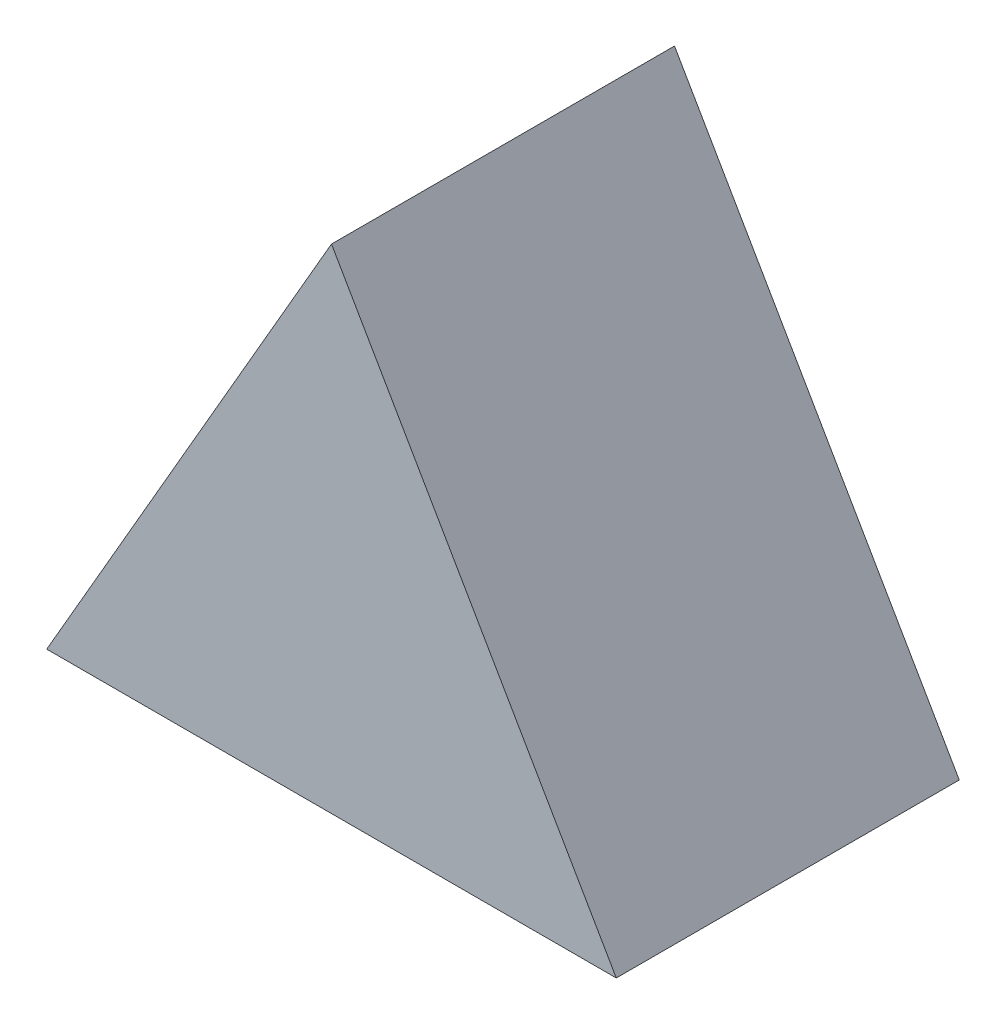
ISO-10303-21;
HEADER;
FILE_DESCRIPTION(('STEP AP214'),'2;1');
FILE_NAME('part.step','',(''),(''),'','','');
FILE_SCHEMA(('AUTOMOTIVE_DESIGN { 1 0 10303 214 1 1 1 1 }'));
ENDSEC;
DATA;
#1=APPLICATION_CONTEXT('core data for automotive mechanical design processes');
#2=APPLICATION_PROTOCOL_DEFINITION('international standard','automotive_design',2000,#1);
#3=PRODUCT_CONTEXT('',#1,'mechanical');
#4=PRODUCT('Part','Part','',(#3));
#5=PRODUCT_RELATED_PRODUCT_CATEGORY('part','',(#4));
#6=PRODUCT_DEFINITION_FORMATION('','',#4);
#7=PRODUCT_DEFINITION_CONTEXT('part definition',#1,'design');
#8=PRODUCT_DEFINITION('design','',#6,#7);
#9=PRODUCT_DEFINITION_SHAPE('','',#8);
#10=(LENGTH_UNIT() NAMED_UNIT(*) SI_UNIT(.MILLI.,.METRE.));
#11=(NAMED_UNIT(*) PLANE_ANGLE_UNIT() SI_UNIT($,.RADIAN.));
#12=(NAMED_UNIT(*) SI_UNIT($,.STERADIAN.) SOLID_ANGLE_UNIT());
#13=UNCERTAINTY_MEASURE_WITH_UNIT(LENGTH_MEASURE(1.E-05),#10,'distance_accuracy_value','');
#14=(GEOMETRIC_REPRESENTATION_CONTEXT(3) GLOBAL_UNCERTAINTY_ASSIGNED_CONTEXT((#13)) GLOBAL_UNIT_ASSIGNED_CONTEXT((#10,
#11,#12)) REPRESENTATION_CONTEXT('',''));
#15=CARTESIAN_POINT('',(0.,0.,0.));
#16=DIRECTION('',(0.,0.,1.));
#17=DIRECTION('',(1.,0.,0.));
#18=AXIS2_PLACEMENT_3D('',#15,#16,#17);
#19=CARTESIAN_POINT('',(2.84589838486225,-2.,3.8));
#20=DIRECTION('',(-0.866025403784439,-0.5,0.));
#21=DIRECTION('',(0.5,-0.866025403784439,0.));
#22=AXIS2_PLACEMENT_3D('',#19,#20,#21);
#23=PLANE('',#22);
#24=DIRECTION('',(-0.5,0.866025403784439,0.));
#25=VECTOR('',#24,1.);
#26=CARTESIAN_POINT('',(2.84589838486225,-2.,0.));
#27=LINE('',#26,#25);
#28=CARTESIAN_POINT('',(2.84589838486225,-2.,0.));
#29=VERTEX_POINT('',#28);
#30=CARTESIAN_POINT('',(-0.309101615137755,3.46462029787981,0.));
#31=VERTEX_POINT('',#30);
#32=EDGE_CURVE('E93',#29,#31,#27,.T.);
#33=ORIENTED_EDGE('',*,*,#32,.T.);
#34=DIRECTION('',(0.,0.,-1.));
#35=VECTOR('',#34,1.);
#36=CARTESIAN_POINT('',(-0.309101615137755,3.46462029787981,3.8));
#37=LINE('',#36,#35);
#38=CARTESIAN_POINT('',(-0.309101615137755,3.46462029787981,3.8));
#39=VERTEX_POINT('',#38);
#40=EDGE_CURVE('E11',#39,#31,#37,.T.);
#41=ORIENTED_EDGE('',*,*,#40,.F.);
#42=DIRECTION('',(-0.5,0.866025403784439,0.));
#43=VECTOR('',#42,1.);
#44=CARTESIAN_POINT('',(2.84589838486225,-2.,3.8));
#45=LINE('',#44,#43);
#46=CARTESIAN_POINT('',(2.84589838486225,-2.,3.8));
#47=VERTEX_POINT('',#46);
#48=EDGE_CURVE('E85',#47,#39,#45,.T.);
#49=ORIENTED_EDGE('',*,*,#48,.F.);
#50=DIRECTION('',(0.,0.,-1.));
#51=VECTOR('',#50,1.);
#52=CARTESIAN_POINT('',(2.84589838486225,-2.,3.8));
#53=LINE('',#52,#51);
#54=EDGE_CURVE('E94',#47,#29,#53,.T.);
#55=ORIENTED_EDGE('',*,*,#54,.T.);
#56=EDGE_LOOP('',(#33,#41,#49,#55));
#57=FACE_BOUND('',#56,.T.);
#58=ADVANCED_FACE('F43',(#57),#23,.F.);
#59=CARTESIAN_POINT('',(-0.309101615137755,3.46462029787981,3.8));
#60=DIRECTION('',(0.866025403784439,-0.5,0.));
#61=DIRECTION('',(0.5,0.866025403784439,0.));
#62=AXIS2_PLACEMENT_3D('',#59,#60,#61);
#63=PLANE('',#62);
#64=DIRECTION('',(-0.5,-0.866025403784439,0.));
#65=VECTOR('',#64,1.);
#66=CARTESIAN_POINT('',(-0.309101615137755,3.46462029787981,0.));
#67=LINE('',#66,#65);
#68=CARTESIAN_POINT('',(-3.46410161513775,-2.,0.));
#69=VERTEX_POINT('',#68);
#70=EDGE_CURVE('E72',#31,#69,#67,.T.);
#71=ORIENTED_EDGE('',*,*,#70,.T.);
#72=DIRECTION('',(0.,0.,-1.));
#73=VECTOR('',#72,1.);
#74=CARTESIAN_POINT('',(-3.46410161513775,-2.,3.8));
#75=LINE('',#74,#73);
#76=CARTESIAN_POINT('',(-3.46410161513775,-2.,3.8));
#77=VERTEX_POINT('',#76);
#78=EDGE_CURVE('E52',#77,#69,#75,.T.);
#79=ORIENTED_EDGE('',*,*,#78,.F.);
#80=DIRECTION('',(-0.5,-0.866025403784439,0.));
#81=VECTOR('',#80,1.);
#82=CARTESIAN_POINT('',(-0.309101615137755,3.46462029787981,3.8));
#83=LINE('',#82,#81);
#84=EDGE_CURVE('E80',#39,#77,#83,.T.);
#85=ORIENTED_EDGE('',*,*,#84,.F.);
#86=ORIENTED_EDGE('',*,*,#40,.T.);
#87=EDGE_LOOP('',(#71,#79,#85,#86));
#88=FACE_BOUND('',#87,.T.);
#89=ADVANCED_FACE('F81',(#88),#63,.F.);
#90=CARTESIAN_POINT('',(-3.46410161513775,-2.,3.8));
#91=DIRECTION('',(0.,1.,0.));
#92=DIRECTION('',(0.,0.,1.));
#93=AXIS2_PLACEMENT_3D('',#90,#91,#92);
#94=PLANE('',#93);
#95=DIRECTION('',(1.,0.,0.));
#96=VECTOR('',#95,1.);
#97=CARTESIAN_POINT('',(-3.46410161513775,-2.,0.));
#98=LINE('',#97,#96);
#99=EDGE_CURVE('E77',#69,#29,#98,.T.);
#100=ORIENTED_EDGE('',*,*,#99,.T.);
#101=ORIENTED_EDGE('',*,*,#54,.F.);
#102=DIRECTION('',(1.,0.,0.));
#103=VECTOR('',#102,1.);
#104=CARTESIAN_POINT('',(-3.46410161513775,-2.,3.8));
#105=LINE('',#104,#103);
#106=EDGE_CURVE('E60',#77,#47,#105,.T.);
#107=ORIENTED_EDGE('',*,*,#106,.F.);
#108=ORIENTED_EDGE('',*,*,#78,.T.);
#109=EDGE_LOOP('',(#100,#101,#107,#108));
#110=FACE_BOUND('',#109,.T.);
#111=ADVANCED_FACE('F106',(#110),#94,.F.);
#112=CARTESIAN_POINT('',(0.,0.,3.8));
#113=DIRECTION('',(0.,0.,1.));
#114=DIRECTION('',(1.,0.,0.));
#115=AXIS2_PLACEMENT_3D('',#112,#113,#114);
#116=PLANE('',#115);
#117=ORIENTED_EDGE('',*,*,#48,.T.);
#118=ORIENTED_EDGE('',*,*,#84,.T.);
#119=ORIENTED_EDGE('',*,*,#106,.T.);
#120=EDGE_LOOP('',(#117,#118,#119));
#121=FACE_BOUND('',#120,.T.);
#122=ADVANCED_FACE('F88',(#121),#116,.T.);
#123=CARTESIAN_POINT('',(0.,0.,0.));
#124=DIRECTION('',(0.,0.,1.));
#125=DIRECTION('',(1.,0.,0.));
#126=AXIS2_PLACEMENT_3D('',#123,#124,#125);
#127=PLANE('',#126);
#128=ORIENTED_EDGE('',*,*,#32,.F.);
#129=ORIENTED_EDGE('',*,*,#99,.F.);
#130=ORIENTED_EDGE('',*,*,#70,.F.);
#131=EDGE_LOOP('',(#128,#129,#130));
#132=FACE_BOUND('',#131,.T.);
#133=ADVANCED_FACE('F107',(#132),#127,.F.);
#134=CLOSED_SHELL('',(#58,#89,#111,#122,#133));
#135=MANIFOLD_SOLID_BREP('B2',#134);
#136=ADVANCED_BREP_SHAPE_REPRESENTATION('',(#18,#135),#14);
#137=SHAPE_DEFINITION_REPRESENTATION(#9,#136);
ENDSEC;
END-ISO-10303-21;
